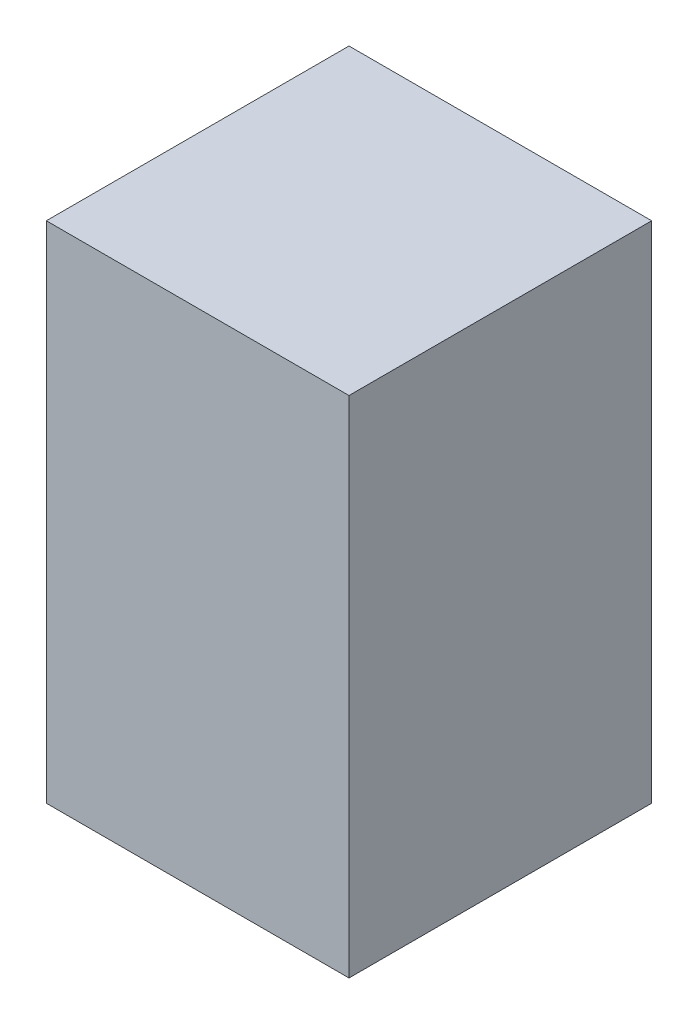
ISO-10303-21;
HEADER;
FILE_DESCRIPTION(('STEP AP214'),'2;1');
FILE_NAME('part.step','',(''),(''),'','','');
FILE_SCHEMA(('AUTOMOTIVE_DESIGN { 1 0 10303 214 1 1 1 1 }'));
ENDSEC;
DATA;
#1=APPLICATION_CONTEXT('core data for automotive mechanical design processes');
#2=APPLICATION_PROTOCOL_DEFINITION('international standard','automotive_design',2000,#1);
#3=PRODUCT_CONTEXT('',#1,'mechanical');
#4=PRODUCT('Part','Part','',(#3));
#5=PRODUCT_RELATED_PRODUCT_CATEGORY('part','',(#4));
#6=PRODUCT_DEFINITION_FORMATION('','',#4);
#7=PRODUCT_DEFINITION_CONTEXT('part definition',#1,'design');
#8=PRODUCT_DEFINITION('design','',#6,#7);
#9=PRODUCT_DEFINITION_SHAPE('','',#8);
#10=(LENGTH_UNIT() NAMED_UNIT(*) SI_UNIT(.MILLI.,.METRE.));
#11=(NAMED_UNIT(*) PLANE_ANGLE_UNIT() SI_UNIT($,.RADIAN.));
#12=(NAMED_UNIT(*) SI_UNIT($,.STERADIAN.) SOLID_ANGLE_UNIT());
#13=UNCERTAINTY_MEASURE_WITH_UNIT(LENGTH_MEASURE(1.E-05),#10,'distance_accuracy_value','');
#14=(GEOMETRIC_REPRESENTATION_CONTEXT(3) GLOBAL_UNCERTAINTY_ASSIGNED_CONTEXT((#13)) GLOBAL_UNIT_ASSIGNED_CONTEXT((#10,
#11,#12)) REPRESENTATION_CONTEXT('',''));
#15=CARTESIAN_POINT('',(0.,0.,0.));
#16=DIRECTION('',(0.,0.,1.));
#17=DIRECTION('',(1.,0.,0.));
#18=AXIS2_PLACEMENT_3D('',#15,#16,#17);
#19=CARTESIAN_POINT('',(15.,50.,15.));
#20=DIRECTION('',(-1.,0.,0.));
#21=DIRECTION('',(0.,0.,1.));
#22=AXIS2_PLACEMENT_3D('',#19,#20,#21);
#23=PLANE('',#22);
#24=DIRECTION('',(0.,0.,-1.));
#25=VECTOR('',#24,1.);
#26=CARTESIAN_POINT('',(15.,0.,15.));
#27=LINE('',#26,#25);
#28=CARTESIAN_POINT('',(15.,0.,15.));
#29=VERTEX_POINT('',#28);
#30=CARTESIAN_POINT('',(15.,0.,-15.));
#31=VERTEX_POINT('',#30);
#32=EDGE_CURVE('E96',#29,#31,#27,.T.);
#33=ORIENTED_EDGE('',*,*,#32,.T.);
#34=DIRECTION('',(0.,-1.,0.));
#35=VECTOR('',#34,1.);
#36=CARTESIAN_POINT('',(15.,50.,-15.));
#37=LINE('',#36,#35);
#38=CARTESIAN_POINT('',(15.,50.,-15.));
#39=VERTEX_POINT('',#38);
#40=EDGE_CURVE('E11',#39,#31,#37,.T.);
#41=ORIENTED_EDGE('',*,*,#40,.F.);
#42=DIRECTION('',(0.,0.,-1.));
#43=VECTOR('',#42,1.);
#44=CARTESIAN_POINT('',(15.,50.,15.));
#45=LINE('',#44,#43);
#46=CARTESIAN_POINT('',(15.,50.,15.));
#47=VERTEX_POINT('',#46);
#48=EDGE_CURVE('E84',#47,#39,#45,.T.);
#49=ORIENTED_EDGE('',*,*,#48,.F.);
#50=DIRECTION('',(0.,-1.,0.));
#51=VECTOR('',#50,1.);
#52=CARTESIAN_POINT('',(15.,50.,15.));
#53=LINE('',#52,#51);
#54=EDGE_CURVE('E92',#47,#29,#53,.T.);
#55=ORIENTED_EDGE('',*,*,#54,.T.);
#56=EDGE_LOOP('',(#33,#41,#49,#55));
#57=FACE_BOUND('',#56,.T.);
#58=ADVANCED_FACE('F33',(#57),#23,.F.);
#59=CARTESIAN_POINT('',(-15.,50.,-15.));
#60=DIRECTION('',(0.,0.,1.));
#61=DIRECTION('',(1.,0.,0.));
#62=AXIS2_PLACEMENT_3D('',#59,#60,#61);
#63=PLANE('',#62);
#64=DIRECTION('',(-1.,0.,0.));
#65=VECTOR('',#64,1.);
#66=CARTESIAN_POINT('',(-15.,0.,-15.));
#67=LINE('',#66,#65);
#68=CARTESIAN_POINT('',(-15.,0.,-15.));
#69=VERTEX_POINT('',#68);
#70=EDGE_CURVE('E88',#31,#69,#67,.T.);
#71=ORIENTED_EDGE('',*,*,#70,.T.);
#72=DIRECTION('',(0.,-1.,0.));
#73=VECTOR('',#72,1.);
#74=CARTESIAN_POINT('',(-15.,50.,-15.));
#75=LINE('',#74,#73);
#76=CARTESIAN_POINT('',(-15.,50.,-15.));
#77=VERTEX_POINT('',#76);
#78=EDGE_CURVE('E41',#77,#69,#75,.T.);
#79=ORIENTED_EDGE('',*,*,#78,.F.);
#80=DIRECTION('',(-1.,0.,0.));
#81=VECTOR('',#80,1.);
#82=CARTESIAN_POINT('',(-15.,50.,-15.));
#83=LINE('',#82,#81);
#84=EDGE_CURVE('E79',#39,#77,#83,.T.);
#85=ORIENTED_EDGE('',*,*,#84,.F.);
#86=ORIENTED_EDGE('',*,*,#40,.T.);
#87=EDGE_LOOP('',(#71,#79,#85,#86));
#88=FACE_BOUND('',#87,.T.);
#89=ADVANCED_FACE('F87',(#88),#63,.F.);
#90=CARTESIAN_POINT('',(-15.,50.,15.));
#91=DIRECTION('',(1.,0.,0.));
#92=DIRECTION('',(0.,0.,-1.));
#93=AXIS2_PLACEMENT_3D('',#90,#91,#92);
#94=PLANE('',#93);
#95=DIRECTION('',(0.,0.,1.));
#96=VECTOR('',#95,1.);
#97=CARTESIAN_POINT('',(-15.,0.,15.));
#98=LINE('',#97,#96);
#99=CARTESIAN_POINT('',(-15.,0.,15.));
#100=VERTEX_POINT('',#99);
#101=EDGE_CURVE('E66',#69,#100,#98,.T.);
#102=ORIENTED_EDGE('',*,*,#101,.T.);
#103=DIRECTION('',(0.,-1.,0.));
#104=VECTOR('',#103,1.);
#105=CARTESIAN_POINT('',(-15.,50.,15.));
#106=LINE('',#105,#104);
#107=CARTESIAN_POINT('',(-15.,50.,15.));
#108=VERTEX_POINT('',#107);
#109=EDGE_CURVE('E89',#108,#100,#106,.T.);
#110=ORIENTED_EDGE('',*,*,#109,.F.);
#111=DIRECTION('',(0.,0.,1.));
#112=VECTOR('',#111,1.);
#113=CARTESIAN_POINT('',(-15.,50.,15.));
#114=LINE('',#113,#112);
#115=EDGE_CURVE('E82',#77,#108,#114,.T.);
#116=ORIENTED_EDGE('',*,*,#115,.F.);
#117=ORIENTED_EDGE('',*,*,#78,.T.);
#118=EDGE_LOOP('',(#102,#110,#116,#117));
#119=FACE_BOUND('',#118,.T.);
#120=ADVANCED_FACE('F90',(#119),#94,.F.);
#121=CARTESIAN_POINT('',(-15.,50.,15.));
#122=DIRECTION('',(0.,0.,-1.));
#123=DIRECTION('',(-1.,0.,0.));
#124=AXIS2_PLACEMENT_3D('',#121,#122,#123);
#125=PLANE('',#124);
#126=DIRECTION('',(1.,0.,0.));
#127=VECTOR('',#126,1.);
#128=CARTESIAN_POINT('',(-15.,0.,15.));
#129=LINE('',#128,#127);
#130=EDGE_CURVE('E72',#100,#29,#129,.T.);
#131=ORIENTED_EDGE('',*,*,#130,.T.);
#132=ORIENTED_EDGE('',*,*,#54,.F.);
#133=DIRECTION('',(1.,0.,0.));
#134=VECTOR('',#133,1.);
#135=CARTESIAN_POINT('',(-15.,50.,15.));
#136=LINE('',#135,#134);
#137=EDGE_CURVE('E49',#108,#47,#136,.T.);
#138=ORIENTED_EDGE('',*,*,#137,.F.);
#139=ORIENTED_EDGE('',*,*,#109,.T.);
#140=EDGE_LOOP('',(#131,#132,#138,#139));
#141=FACE_BOUND('',#140,.T.);
#142=ADVANCED_FACE('F103',(#141),#125,.F.);
#143=CARTESIAN_POINT('',(0.,50.,0.));
#144=DIRECTION('',(0.,-1.,0.));
#145=DIRECTION('',(0.,0.,-1.));
#146=AXIS2_PLACEMENT_3D('',#143,#144,#145);
#147=PLANE('',#146);
#148=ORIENTED_EDGE('',*,*,#48,.T.);
#149=ORIENTED_EDGE('',*,*,#84,.T.);
#150=ORIENTED_EDGE('',*,*,#115,.T.);
#151=ORIENTED_EDGE('',*,*,#137,.T.);
#152=EDGE_LOOP('',(#148,#149,#150,#151));
#153=FACE_BOUND('',#152,.T.);
#154=ADVANCED_FACE('F80',(#153),#147,.F.);
#155=CARTESIAN_POINT('',(0.,0.,0.));
#156=DIRECTION('',(0.,-1.,0.));
#157=DIRECTION('',(0.,0.,-1.));
#158=AXIS2_PLACEMENT_3D('',#155,#156,#157);
#159=PLANE('',#158);
#160=ORIENTED_EDGE('',*,*,#32,.F.);
#161=ORIENTED_EDGE('',*,*,#130,.F.);
#162=ORIENTED_EDGE('',*,*,#101,.F.);
#163=ORIENTED_EDGE('',*,*,#70,.F.);
#164=EDGE_LOOP('',(#160,#161,#162,#163));
#165=FACE_BOUND('',#164,.T.);
#166=ADVANCED_FACE('F106',(#165),#159,.T.);
#167=CLOSED_SHELL('',(#58,#89,#120,#142,#154,#166));
#168=MANIFOLD_SOLID_BREP('B2',#167);
#169=ADVANCED_BREP_SHAPE_REPRESENTATION('',(#18,#168),#14);
#170=SHAPE_DEFINITION_REPRESENTATION(#9,#169);
ENDSEC;
END-ISO-10303-21;
